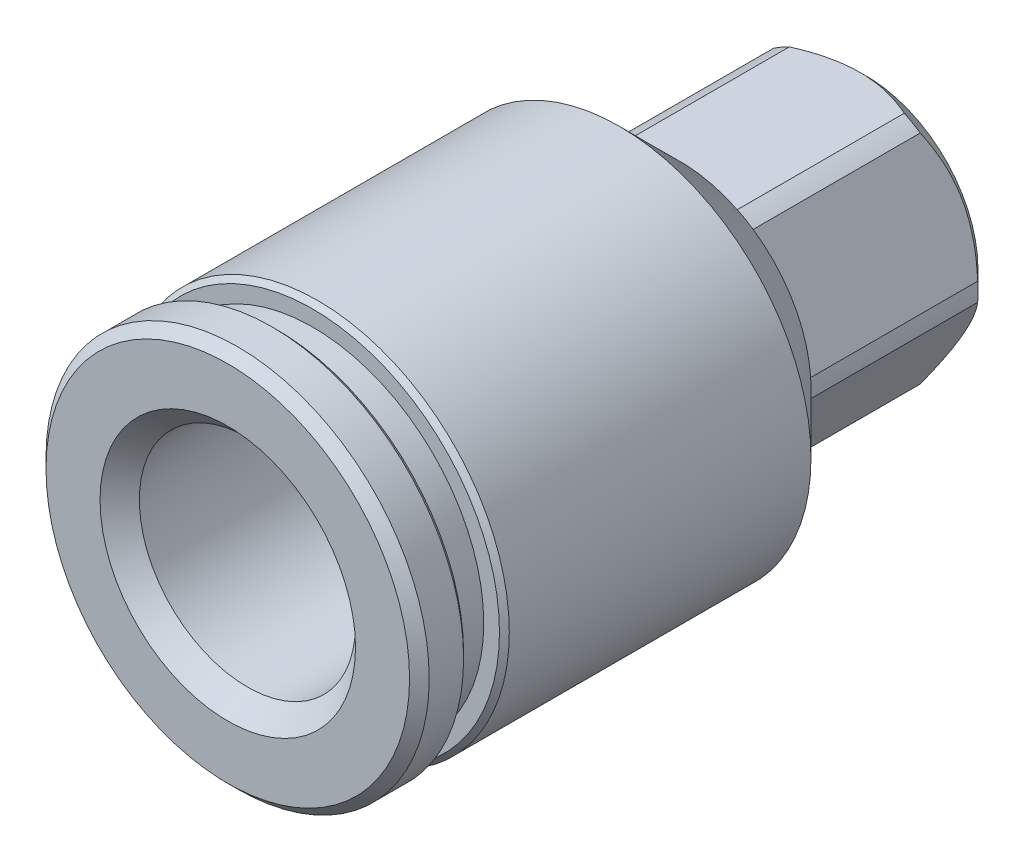
ISO-10303-21;
HEADER;
FILE_DESCRIPTION(('STEP AP214'),'2;1');
FILE_NAME('part.step','',(''),(''),'','','');
FILE_SCHEMA(('AUTOMOTIVE_DESIGN { 1 0 10303 214 1 1 1 1 }'));
ENDSEC;
DATA;
#1=APPLICATION_CONTEXT('core data for automotive mechanical design processes');
#2=APPLICATION_PROTOCOL_DEFINITION('international standard','automotive_design',2000,#1);
#3=PRODUCT_CONTEXT('',#1,'mechanical');
#4=PRODUCT('Part','Part','',(#3));
#5=PRODUCT_RELATED_PRODUCT_CATEGORY('part','',(#4));
#6=PRODUCT_DEFINITION_FORMATION('','',#4);
#7=PRODUCT_DEFINITION_CONTEXT('part definition',#1,'design');
#8=PRODUCT_DEFINITION('design','',#6,#7);
#9=PRODUCT_DEFINITION_SHAPE('','',#8);
#10=(LENGTH_UNIT() NAMED_UNIT(*) SI_UNIT(.MILLI.,.METRE.));
#11=(NAMED_UNIT(*) PLANE_ANGLE_UNIT() SI_UNIT($,.RADIAN.));
#12=(NAMED_UNIT(*) SI_UNIT($,.STERADIAN.) SOLID_ANGLE_UNIT());
#13=UNCERTAINTY_MEASURE_WITH_UNIT(LENGTH_MEASURE(1.E-05),#10,'distance_accuracy_value','');
#14=(GEOMETRIC_REPRESENTATION_CONTEXT(3) GLOBAL_UNCERTAINTY_ASSIGNED_CONTEXT((#13)) GLOBAL_UNIT_ASSIGNED_CONTEXT((#10,
#11,#12)) REPRESENTATION_CONTEXT('',''));
#15=CARTESIAN_POINT('',(0.,0.,0.));
#16=DIRECTION('',(0.,0.,1.));
#17=DIRECTION('',(1.,0.,0.));
#18=AXIS2_PLACEMENT_3D('',#15,#16,#17);
#19=CARTESIAN_POINT('',(0.,0.,-65.));
#20=DIRECTION('',(0.,0.,1.));
#21=DIRECTION('',(1.,0.,0.));
#22=AXIS2_PLACEMENT_3D('',#19,#20,#21);
#23=CONICAL_SURFACE('',#22,11.35,0.785398163397434);
#24=CARTESIAN_POINT('',(0.,0.,-65.));
#25=DIRECTION('',(0.,0.,1.));
#26=DIRECTION('',(1.,0.,0.));
#27=AXIS2_PLACEMENT_3D('',#24,#25,#26);
#28=CIRCLE('',#27,11.35);
#29=CARTESIAN_POINT('',(11.35,0.,-65.));
#30=VERTEX_POINT('',#29);
#31=EDGE_CURVE('E12',#30,#30,#28,.T.);
#32=ORIENTED_EDGE('',*,*,#31,.T.);
#33=EDGE_LOOP('',(#32));
#34=FACE_BOUND('',#33,.T.);
#35=CARTESIAN_POINT('',(13.3175330433493,0.933356137441655,-62.9997999999999));
#36=CARTESIAN_POINT('',(13.107581088092,1.29700359109579,-63.1838289213796));
#37=CARTESIAN_POINT('',(12.8943576599389,1.66631740202087,-63.3547115315857));
#38=CARTESIAN_POINT('',(12.46114372675,2.41666594485073,-63.6631506433928));
#39=CARTESIAN_POINT('',(12.2411315290394,2.79773824957038,-63.8005843311892));
#40=CARTESIAN_POINT('',(11.9082338706203,3.37433390767311,-63.9747459432874));
#41=CARTESIAN_POINT('',(11.7974122503937,3.56628258448257,-64.0272632826221));
#42=CARTESIAN_POINT('',(11.574606297149,3.95219381573119,-64.1211840504004));
#43=CARTESIAN_POINT('',(11.4626221355784,4.14615607321463,-64.1625890941249));
#44=CARTESIAN_POINT('',(11.2378628931056,4.53545050064811,-64.2334541693245));
#45=CARTESIAN_POINT('',(11.1250890820435,4.7307804711708,-64.2629302295379));
#46=CARTESIAN_POINT('',(10.8988982922271,5.12255441133695,-64.3094045670442));
#47=CARTESIAN_POINT('',(10.7854813292948,5.31899835357589,-64.3264031499617));
#48=CARTESIAN_POINT('',(10.5656465420787,5.69976337430528,-64.3468709014907));
#49=CARTESIAN_POINT('',(10.4592472313394,5.88405238639599,-64.3511391875582));
#50=CARTESIAN_POINT('',(10.2464919242042,6.25255538793413,-64.348342437929));
#51=CARTESIAN_POINT('',(10.1401359256667,6.43676938109086,-64.3412780548952));
#52=CARTESIAN_POINT('',(9.92771138430616,6.80469947950177,-64.3159477033839));
#53=CARTESIAN_POINT('',(9.82164298796551,6.98841533104113,-64.2976768248806));
#54=CARTESIAN_POINT('',(9.61010842017716,7.35480395000769,-64.2502859501648));
#55=CARTESIAN_POINT('',(9.50464233893754,7.53747656118989,-64.2211643699888));
#56=CARTESIAN_POINT('',(9.18962933819775,8.08309508351595,-64.1183036629273));
#57=CARTESIAN_POINT('',(8.98131536768569,8.44390546436923,-64.0290491810026));
#58=CARTESIAN_POINT('',(8.56939078005538,9.15737977903178,-63.8147136095524));
#59=CARTESIAN_POINT('',(8.36578168436937,9.51004107764311,-63.6896211014258));
#60=CARTESIAN_POINT('',(8.0465301727725,10.0630009161221,-63.4673972169287));
#61=CARTESIAN_POINT('',(7.92916804664934,10.2662780814517,-63.3799429654052));
#62=CARTESIAN_POINT('',(7.7546679780071,10.5685210662643,-63.2420961830428));
#63=CARTESIAN_POINT('',(7.69685211821126,10.668661072914,-63.1951188998973));
#64=CARTESIAN_POINT('',(7.58164348742745,10.868208274902,-63.0990262705877));
#65=CARTESIAN_POINT('',(7.52425086378998,10.9676152150217,-63.049910217426));
#66=CARTESIAN_POINT('',(7.46707664747725,11.0666438625583,-62.9997999999999));
#67=B_SPLINE_CURVE_WITH_KNOTS('',3,(#35,#36,#37,#38,#39,#40,#41,#42,#43,#44,#45,#46,#47,#48,#49,
#50,#51,#52,#53,#54,#55,#56,#57,#58,#59,#60,#61,#62,#63,#64,#65,#66),.UNSPECIFIED.,.F.,.F.,(4,2,
2,2,2,2,2,2,2,2,2,2,2,2,2,4),(0.,1.37630499030271,2.75758957563814,3.44067512595391,
4.12366132926286,4.80572674601863,5.48777545563401,6.12600110486054,6.76418999917248,
7.40265871018195,8.04122066010621,9.31743314078434,10.5940526974263,11.345327394544,
11.7197376011185,12.0942725274741),.UNSPECIFIED.);
#68=CARTESIAN_POINT('',(13.3173048454133,0.933751387861032,-62.9999999999999));
#69=VERTEX_POINT('',#68);
#70=CARTESIAN_POINT('',(7.46730484541327,11.066248612139,-62.9999999999999));
#71=VERTEX_POINT('',#70);
#72=EDGE_CURVE('E299',#69,#71,#67,.T.);
#73=ORIENTED_EDGE('',*,*,#72,.F.);
#74=CARTESIAN_POINT('',(0.,0.,-62.9999999999999));
#75=DIRECTION('',(0.,0.,1.));
#76=DIRECTION('',(1.,0.,0.));
#77=AXIS2_PLACEMENT_3D('',#74,#75,#76);
#78=CIRCLE('',#77,13.35);
#79=CARTESIAN_POINT('',(13.3173048454133,-0.933751387861046,-62.9999999999999));
#80=VERTEX_POINT('',#79);
#81=EDGE_CURVE('E170',#80,#69,#78,.T.);
#82=ORIENTED_EDGE('',*,*,#81,.F.);
#83=CARTESIAN_POINT('',(7.46707664747724,-11.0666438625583,-62.9997999999999));
#84=CARTESIAN_POINT('',(7.67702860273458,-10.7029964089042,-63.1838289213796));
#85=CARTESIAN_POINT('',(7.89025203088762,-10.3336825979791,-63.3547115315857));
#86=CARTESIAN_POINT('',(8.32346596407649,-9.58333405514926,-63.6631506433928));
#87=CARTESIAN_POINT('',(8.54347816178709,-9.20226175042961,-63.8005843311892));
#88=CARTESIAN_POINT('',(8.87637582020627,-8.62566609232688,-63.9747459432874));
#89=CARTESIAN_POINT('',(8.9871974404328,-8.43371741551741,-64.0272632826221));
#90=CARTESIAN_POINT('',(9.2100033936775,-8.0478061842688,-64.1211840504004));
#91=CARTESIAN_POINT('',(9.32198755524819,-7.85384392678536,-64.1625890941249));
#92=CARTESIAN_POINT('',(9.54674679772093,-7.46454949935187,-64.2334541693245));
#93=CARTESIAN_POINT('',(9.65952060878301,-7.26921952882918,-64.2629302295379));
#94=CARTESIAN_POINT('',(9.88571139859941,-6.87744558866303,-64.3094045670442));
#95=CARTESIAN_POINT('',(9.99912836153174,-6.68100164642409,-64.3264031499617));
#96=CARTESIAN_POINT('',(10.2189631487478,-6.3002366256947,-64.3468709014907));
#97=CARTESIAN_POINT('',(10.3253624594871,-6.11594761360399,-64.3511391875582));
#98=CARTESIAN_POINT('',(10.5381177666223,-5.74744461206585,-64.348342437929));
#99=CARTESIAN_POINT('',(10.6444737651599,-5.56323061890912,-64.3412780548952));
#100=CARTESIAN_POINT('',(10.8568983065204,-5.19530052049821,-64.3159477033839));
#101=CARTESIAN_POINT('',(10.962966702861,-5.01158466895885,-64.2976768248806));
#102=CARTESIAN_POINT('',(11.1745012706494,-4.6451960499923,-64.2502859501648));
#103=CARTESIAN_POINT('',(11.279967351889,-4.4625234388101,-64.2211643699888));
#104=CARTESIAN_POINT('',(11.5949803526288,-3.91690491648404,-64.1183036629273));
#105=CARTESIAN_POINT('',(11.8032943231408,-3.55609453563076,-64.0290491810026));
#106=CARTESIAN_POINT('',(12.2152189107711,-2.84262022096821,-63.8147136095524));
#107=CARTESIAN_POINT('',(12.4188280064572,-2.48995892235689,-63.6896211014257));
#108=CARTESIAN_POINT('',(12.738079518054,-1.93699908387794,-63.4673972169287));
#109=CARTESIAN_POINT('',(12.8554416441772,-1.73372191854831,-63.3799429654052));
#110=CARTESIAN_POINT('',(13.0299417128194,-1.4314789337357,-63.2420961830428));
#111=CARTESIAN_POINT('',(13.0877575726153,-1.33133892708603,-63.1951188998973));
#112=CARTESIAN_POINT('',(13.2029662033991,-1.13179172509804,-63.0990262705877));
#113=CARTESIAN_POINT('',(13.2603588270365,-1.03238478497826,-63.049910217426));
#114=CARTESIAN_POINT('',(13.3175330433493,-0.933356137441667,-62.9997999999999));
#115=B_SPLINE_CURVE_WITH_KNOTS('',3,(#83,#84,#85,#86,#87,#88,#89,#90,#91,#92,#93,#94,#95,#96,
#97,#98,#99,#100,#101,#102,#103,#104,#105,#106,#107,#108,#109,#110,#111,#112,#113,#114),
.UNSPECIFIED.,.F.,.F.,(4,2,2,2,2,2,2,2,2,2,2,2,2,2,2,4),(0.,1.37630499030272,2.75758957563815,
3.44067512595393,4.12366132926287,4.80572674601865,5.48777545563403,6.12600110486056,
6.7641899991725,7.40265871018196,8.04122066010622,9.31743314078435,10.5940526974263,
11.345327394544,11.7197376011185,12.0942725274741),.UNSPECIFIED.);
#116=CARTESIAN_POINT('',(7.46730484541327,-11.066248612139,-62.9999999999999));
#117=VERTEX_POINT('',#116);
#118=EDGE_CURVE('E156',#117,#80,#115,.T.);
#119=ORIENTED_EDGE('',*,*,#118,.F.);
#120=CARTESIAN_POINT('',(5.84999999999999,-12.,-62.9999999999999));
#121=VERTEX_POINT('',#120);
#122=EDGE_CURVE('E154',#121,#117,#78,.T.);
#123=ORIENTED_EDGE('',*,*,#122,.F.);
#124=CARTESIAN_POINT('',(-13.9959671430104,-12.,-57.9139728718947));
#125=CARTESIAN_POINT('',(-13.655972504965,-12.,-58.1720260418189));
#126=CARTESIAN_POINT('',(-13.3140943340846,-12.,-58.4276375764839));
#127=CARTESIAN_POINT('',(-12.6258202988367,-12.,-58.9328778380004));
#128=CARTESIAN_POINT('',(-12.2794233399434,-12.,-59.1825050721873));
#129=CARTESIAN_POINT('',(-11.5788269287501,-12.,-59.6764532175205));
#130=CARTESIAN_POINT('',(-11.2245878331731,-12.,-59.9207180889164));
#131=CARTESIAN_POINT('',(-10.510128396445,-12.,-60.4003089568614));
#132=CARTESIAN_POINT('',(-10.1499084771657,-12.,-60.6356355800741));
#133=CARTESIAN_POINT('',(-9.40110346500125,-12.,-61.1088836933085));
#134=CARTESIAN_POINT('',(-9.01209711891329,-12.,-61.3461420219312));
#135=CARTESIAN_POINT('',(-8.22498597801741,-12.,-61.8053041441749));
#136=CARTESIAN_POINT('',(-7.82687973011901,-12.,-62.0272054624484));
#137=CARTESIAN_POINT('',(-7.02156471949106,-12.,-62.4508828099975));
#138=CARTESIAN_POINT('',(-6.61438733055164,-12.,-62.6527180069125));
#139=CARTESIAN_POINT('',(-5.78881085576363,-12.,-63.0317434056531));
#140=CARTESIAN_POINT('',(-5.37041701747139,-12.,-63.2089449002385));
#141=CARTESIAN_POINT('',(-4.55809160543395,-12.,-63.5184901303749));
#142=CARTESIAN_POINT('',(-4.16513944668681,-12.,-63.653377621918));
#143=CARTESIAN_POINT('',(-3.36961858582673,-12.,-63.8916511296326));
#144=CARTESIAN_POINT('',(-2.96704923813904,-12.,-63.9950350246127));
#145=CARTESIAN_POINT('',(-2.16148026748497,-12.,-64.1631281310119));
#146=CARTESIAN_POINT('',(-1.75862355772667,-12.,-64.228510979135));
#147=CARTESIAN_POINT('',(-0.948406607495053,-12.,-64.3193046012214));
#148=CARTESIAN_POINT('',(-0.541047197216002,-12.,-64.3447226239451));
#149=CARTESIAN_POINT('',(0.258556700782232,-12.,-64.3536198703743));
#150=CARTESIAN_POINT('',(0.650784241377107,-12.,-64.3386638203498));
#151=CARTESIAN_POINT('',(1.43196598801515,-12.,-64.2711338455311));
#152=CARTESIAN_POINT('',(1.82091987787232,-12.,-64.2185563283062));
#153=CARTESIAN_POINT('',(2.59931862183159,-12.,-64.0777870116478));
#154=CARTESIAN_POINT('',(2.98865092141848,-12.,-63.9889828662625));
#155=CARTESIAN_POINT('',(3.75880927651416,-12.,-63.7805494475961));
#156=CARTESIAN_POINT('',(4.13963597901562,-12.,-63.6609225276393));
#157=CARTESIAN_POINT('',(4.92327190267341,-12.,-63.3849270733333));
#158=CARTESIAN_POINT('',(5.3252902568966,-12.,-63.2263364217151));
#159=CARTESIAN_POINT('',(6.11891723152593,-12.,-62.8847582802187));
#160=CARTESIAN_POINT('',(6.51052094914837,-12.,-62.701759535581));
#161=CARTESIAN_POINT('',(7.28521230914159,-12.,-62.3157142979146));
#162=CARTESIAN_POINT('',(7.66826850616428,-12.,-62.1126052113187));
#163=CARTESIAN_POINT('',(8.42557770417047,-12.,-61.6908225727586));
#164=CARTESIAN_POINT('',(8.79983207919242,-12.,-61.4721514719033));
#165=CARTESIAN_POINT('',(9.52231682630743,-12.,-61.0334629008683));
#166=CARTESIAN_POINT('',(9.87091685808529,-12.,-60.8140510166536));
#167=CARTESIAN_POINT('',(10.5621306733485,-12.,-60.3659643480273));
#168=CARTESIAN_POINT('',(10.9047440019258,-12.,-60.1372888640514));
#169=CARTESIAN_POINT('',(11.5819966281995,-12.,-59.6742100755807));
#170=CARTESIAN_POINT('',(11.9166780232737,-12.,-59.4398681176826));
#171=CARTESIAN_POINT('',(12.5814612541788,-12.,-58.964959807398));
#172=CARTESIAN_POINT('',(12.9115643251747,-12.,-58.7243951860269));
#173=CARTESIAN_POINT('',(13.2397491555612,-12.,-58.4812855050457));
#174=B_SPLINE_CURVE_WITH_KNOTS('',3,(#124,#125,#126,#127,#128,#129,#130,#131,#132,#133,#134,
#135,#136,#137,#138,#139,#140,#141,#142,#143,#144,#145,#146,#147,#148,#149,#150,#151,#152,#153,
#154,#155,#156,#157,#158,#159,#160,#161,#162,#163,#164,#165,#166,#167,#168,#169,#170,#171,#172,
#173),.UNSPECIFIED.,.F.,.F.,(4,2,2,2,2,2,2,2,2,2,2,2,2,2,2,2,2,2,2,2,2,2,2,2,4),(0.,
1.2805286669691,2.56137348123737,3.85213402337947,5.14280390219152,6.50947376830465,
7.8763634129536,9.23909498419655,10.6011997674229,11.8464874157793,13.0918588929809,
14.3144217882291,15.5367629112497,16.7124180863993,17.8881855384946,19.0847099166776,
20.2811429670701,21.5766445337847,22.8727455448425,24.1730156891325,25.473081484558,
26.7086166231792,27.9442452409692,29.169872099187,30.3951616042759),.UNSPECIFIED.);
#175=CARTESIAN_POINT('',(-5.84999999999999,-12.,-62.9999999999999));
#176=VERTEX_POINT('',#175);
#177=EDGE_CURVE('E222',#176,#121,#174,.T.);
#178=ORIENTED_EDGE('',*,*,#177,.F.);
#179=CARTESIAN_POINT('',(-7.46730484541327,-11.066248612139,-62.9999999999999));
#180=VERTEX_POINT('',#179);
#181=EDGE_CURVE('E181',#180,#176,#78,.T.);
#182=ORIENTED_EDGE('',*,*,#181,.F.);
#183=CARTESIAN_POINT('',(-13.3175330433493,-0.933356137441659,-62.9997999999999));
#184=CARTESIAN_POINT('',(-13.1075810880919,-1.29700359109579,-63.1838289213796));
#185=CARTESIAN_POINT('',(-12.8943576599389,-1.66631740202087,-63.3547115315857));
#186=CARTESIAN_POINT('',(-12.46114372675,-2.41666594485073,-63.6631506433928));
#187=CARTESIAN_POINT('',(-12.2411315290394,-2.79773824957038,-63.8005843311892));
#188=CARTESIAN_POINT('',(-11.9082338706203,-3.37433390767311,-63.9747459432874));
#189=CARTESIAN_POINT('',(-11.7974122503937,-3.56628258448258,-64.0272632826221));
#190=CARTESIAN_POINT('',(-11.574606297149,-3.9521938157312,-64.1211840504004));
#191=CARTESIAN_POINT('',(-11.4626221355783,-4.14615607321463,-64.1625890941249));
#192=CARTESIAN_POINT('',(-11.2378628931056,-4.53545050064812,-64.2334541693245));
#193=CARTESIAN_POINT('',(-11.1250890820435,-4.7307804711708,-64.2629302295379));
#194=CARTESIAN_POINT('',(-10.8988982922271,-5.12255441133695,-64.3094045670442));
#195=CARTESIAN_POINT('',(-10.7854813292948,-5.3189983535759,-64.3264031499617));
#196=CARTESIAN_POINT('',(-10.5656465420787,-5.69976337430529,-64.3468709014907));
#197=CARTESIAN_POINT('',(-10.4592472313394,-5.88405238639599,-64.3511391875582));
#198=CARTESIAN_POINT('',(-10.2464919242042,-6.25255538793414,-64.348342437929));
#199=CARTESIAN_POINT('',(-10.1401359256667,-6.43676938109087,-64.3412780548952));
#200=CARTESIAN_POINT('',(-9.92771138430616,-6.80469947950178,-64.3159477033839));
#201=CARTESIAN_POINT('',(-9.82164298796551,-6.98841533104114,-64.2976768248806));
#202=CARTESIAN_POINT('',(-9.61010842017716,-7.35480395000769,-64.2502859501648));
#203=CARTESIAN_POINT('',(-9.50464233893754,-7.53747656118989,-64.2211643699888));
#204=CARTESIAN_POINT('',(-9.18962933819774,-8.08309508351596,-64.1183036629273));
#205=CARTESIAN_POINT('',(-8.98131536768569,-8.44390546436924,-64.0290491810026));
#206=CARTESIAN_POINT('',(-8.56939078005538,-9.15737977903179,-63.8147136095524));
#207=CARTESIAN_POINT('',(-8.36578168436937,-9.51004107764311,-63.6896211014258));
#208=CARTESIAN_POINT('',(-8.0465301727725,-10.0630009161221,-63.4673972169287));
#209=CARTESIAN_POINT('',(-7.92916804664934,-10.2662780814517,-63.3799429654052));
#210=CARTESIAN_POINT('',(-7.7546679780071,-10.5685210662643,-63.2420961830428));
#211=CARTESIAN_POINT('',(-7.69685211821126,-10.668661072914,-63.1951188998973));
#212=CARTESIAN_POINT('',(-7.58164348742745,-10.868208274902,-63.0990262705877));
#213=CARTESIAN_POINT('',(-7.52425086378998,-10.9676152150217,-63.049910217426));
#214=CARTESIAN_POINT('',(-7.46707664747724,-11.0666438625583,-62.9997999999999));
#215=B_SPLINE_CURVE_WITH_KNOTS('',3,(#183,#184,#185,#186,#187,#188,#189,#190,#191,#192,#193,
#194,#195,#196,#197,#198,#199,#200,#201,#202,#203,#204,#205,#206,#207,#208,#209,#210,#211,#212,
#213,#214),.UNSPECIFIED.,.F.,.F.,(4,2,2,2,2,2,2,2,2,2,2,2,2,2,2,4),(0.,1.37630499030271,
2.75758957563814,3.44067512595391,4.12366132926286,4.80572674601863,5.48777545563401,
6.12600110486055,6.76418999917248,7.40265871018195,8.04122066010621,9.31743314078434,
10.5940526974263,11.345327394544,11.7197376011185,12.0942725274741),.UNSPECIFIED.);
#216=CARTESIAN_POINT('',(-13.3173048454133,-0.933751387861039,-62.9999999999999));
#217=VERTEX_POINT('',#216);
#218=EDGE_CURVE('E221',#217,#180,#215,.T.);
#219=ORIENTED_EDGE('',*,*,#218,.F.);
#220=CARTESIAN_POINT('',(-13.3173048454133,0.93375138786104,-62.9999999999999));
#221=VERTEX_POINT('',#220);
#222=EDGE_CURVE('E192',#221,#217,#78,.T.);
#223=ORIENTED_EDGE('',*,*,#222,.F.);
#224=CARTESIAN_POINT('',(-7.46707664747724,11.0666438625583,-62.9997999999999));
#225=CARTESIAN_POINT('',(-7.67702860273458,10.7029964089042,-63.1838289213796));
#226=CARTESIAN_POINT('',(-7.89025203088762,10.3336825979791,-63.3547115315857));
#227=CARTESIAN_POINT('',(-8.32346596407648,9.58333405514926,-63.6631506433928));
#228=CARTESIAN_POINT('',(-8.54347816178708,9.20226175042962,-63.8005843311892));
#229=CARTESIAN_POINT('',(-8.87637582020627,8.62566609232689,-63.9747459432874));
#230=CARTESIAN_POINT('',(-8.9871974404328,8.43371741551742,-64.0272632826221));
#231=CARTESIAN_POINT('',(-9.21000339367749,8.0478061842688,-64.1211840504004));
#232=CARTESIAN_POINT('',(-9.32198755524818,7.85384392678537,-64.1625890941249));
#233=CARTESIAN_POINT('',(-9.54674679772092,7.46454949935188,-64.2334541693245));
#234=CARTESIAN_POINT('',(-9.659520608783,7.2692195288292,-64.2629302295379));
#235=CARTESIAN_POINT('',(-9.8857113985994,6.87744558866305,-64.3094045670442));
#236=CARTESIAN_POINT('',(-9.99912836153173,6.68100164642411,-64.3264031499617));
#237=CARTESIAN_POINT('',(-10.2189631487478,6.30023662569472,-64.3468709014907));
#238=CARTESIAN_POINT('',(-10.3253624594871,6.11594761360401,-64.3511391875582));
#239=CARTESIAN_POINT('',(-10.5381177666223,5.74744461206587,-64.348342437929));
#240=CARTESIAN_POINT('',(-10.6444737651599,5.56323061890913,-64.3412780548952));
#241=CARTESIAN_POINT('',(-10.8568983065204,5.19530052049822,-64.3159477033839));
#242=CARTESIAN_POINT('',(-10.962966702861,5.01158466895886,-64.2976768248806));
#243=CARTESIAN_POINT('',(-11.1745012706494,4.64519604999231,-64.2502859501648));
#244=CARTESIAN_POINT('',(-11.279967351889,4.46252343881011,-64.2211643699888));
#245=CARTESIAN_POINT('',(-11.5949803526288,3.91690491648405,-64.1183036629273));
#246=CARTESIAN_POINT('',(-11.8032943231408,3.55609453563076,-64.0290491810026));
#247=CARTESIAN_POINT('',(-12.2152189107711,2.84262022096822,-63.8147136095524));
#248=CARTESIAN_POINT('',(-12.4188280064572,2.48995892235689,-63.6896211014258));
#249=CARTESIAN_POINT('',(-12.738079518054,1.93699908387794,-63.4673972169287));
#250=CARTESIAN_POINT('',(-12.8554416441772,1.73372191854832,-63.3799429654052));
#251=CARTESIAN_POINT('',(-13.0299417128194,1.43147893373571,-63.2420961830428));
#252=CARTESIAN_POINT('',(-13.0877575726153,1.33133892708603,-63.1951188998973));
#253=CARTESIAN_POINT('',(-13.2029662033991,1.13179172509804,-63.0990262705877));
#254=CARTESIAN_POINT('',(-13.2603588270365,1.03238478497826,-63.049910217426));
#255=CARTESIAN_POINT('',(-13.3175330433493,0.933356137441664,-62.9997999999999));
#256=B_SPLINE_CURVE_WITH_KNOTS('',3,(#224,#225,#226,#227,#228,#229,#230,#231,#232,#233,#234,
#235,#236,#237,#238,#239,#240,#241,#242,#243,#244,#245,#246,#247,#248,#249,#250,#251,#252,#253,
#254,#255),.UNSPECIFIED.,.F.,.F.,(4,2,2,2,2,2,2,2,2,2,2,2,2,2,2,4),(0.,1.37630499030271,
2.75758957563814,3.44067512595391,4.12366132926286,4.80572674601863,5.48777545563401,
6.12600110486054,6.76418999917248,7.40265871018195,8.04122066010621,9.31743314078434,
10.5940526974263,11.345327394544,11.7197376011185,12.0942725274741),.UNSPECIFIED.);
#257=CARTESIAN_POINT('',(-7.46730484541327,11.066248612139,-62.9999999999999));
#258=VERTEX_POINT('',#257);
#259=EDGE_CURVE('E401',#258,#221,#256,.T.);
#260=ORIENTED_EDGE('',*,*,#259,.F.);
#261=CARTESIAN_POINT('',(-5.84999999999999,12.,-62.9999999999999));
#262=VERTEX_POINT('',#261);
#263=EDGE_CURVE('E184',#262,#258,#78,.T.);
#264=ORIENTED_EDGE('',*,*,#263,.F.);
#265=CARTESIAN_POINT('',(-13.9959671430104,12.,-57.9139728718947));
#266=CARTESIAN_POINT('',(-13.655972504965,12.,-58.1720260418189));
#267=CARTESIAN_POINT('',(-13.3140943340846,12.,-58.4276375764839));
#268=CARTESIAN_POINT('',(-12.6258202988367,12.,-58.9328778380004));
#269=CARTESIAN_POINT('',(-12.2794233399434,12.,-59.1825050721874));
#270=CARTESIAN_POINT('',(-11.5788269287501,12.,-59.6764532175205));
#271=CARTESIAN_POINT('',(-11.2245878331731,12.,-59.9207180889164));
#272=CARTESIAN_POINT('',(-10.510128396445,12.,-60.4003089568614));
#273=CARTESIAN_POINT('',(-10.1499084771657,12.,-60.6356355800741));
#274=CARTESIAN_POINT('',(-9.40110346500124,12.,-61.1088836933085));
#275=CARTESIAN_POINT('',(-9.01209711891329,12.,-61.3461420219312));
#276=CARTESIAN_POINT('',(-8.22498597801741,12.,-61.8053041441749));
#277=CARTESIAN_POINT('',(-7.82687973011901,12.,-62.0272054624484));
#278=CARTESIAN_POINT('',(-7.02156471949106,12.,-62.4508828099975));
#279=CARTESIAN_POINT('',(-6.61438733055164,12.,-62.6527180069125));
#280=CARTESIAN_POINT('',(-5.78881085576362,12.,-63.0317434056531));
#281=CARTESIAN_POINT('',(-5.37041701747138,12.,-63.2089449002385));
#282=CARTESIAN_POINT('',(-4.55809160543393,12.,-63.5184901303749));
#283=CARTESIAN_POINT('',(-4.1651394466868,12.,-63.653377621918));
#284=CARTESIAN_POINT('',(-3.36961858582673,12.,-63.8916511296326));
#285=CARTESIAN_POINT('',(-2.96704923813903,12.,-63.9950350246127));
#286=CARTESIAN_POINT('',(-2.16148026748496,12.,-64.1631281310119));
#287=CARTESIAN_POINT('',(-1.75862355772666,12.,-64.228510979135));
#288=CARTESIAN_POINT('',(-0.948406607495045,12.,-64.3193046012214));
#289=CARTESIAN_POINT('',(-0.541047197215995,12.,-64.3447226239451));
#290=CARTESIAN_POINT('',(0.258556700782238,12.,-64.3536198703743));
#291=CARTESIAN_POINT('',(0.650784241377112,12.,-64.3386638203498));
#292=CARTESIAN_POINT('',(1.43196598801516,12.,-64.2711338455311));
#293=CARTESIAN_POINT('',(1.82091987787232,12.,-64.2185563283062));
#294=CARTESIAN_POINT('',(2.59931862183159,12.,-64.0777870116478));
#295=CARTESIAN_POINT('',(2.98865092141848,12.,-63.9889828662625));
#296=CARTESIAN_POINT('',(3.75880927651416,12.,-63.7805494475961));
#297=CARTESIAN_POINT('',(4.13963597901563,12.,-63.6609225276393));
#298=CARTESIAN_POINT('',(4.92327190267341,12.,-63.3849270733333));
#299=CARTESIAN_POINT('',(5.3252902568966,12.,-63.2263364217151));
#300=CARTESIAN_POINT('',(6.11891723152594,12.,-62.8847582802187));
#301=CARTESIAN_POINT('',(6.51052094914838,12.,-62.701759535581));
#302=CARTESIAN_POINT('',(7.2852123091416,12.,-62.3157142979146));
#303=CARTESIAN_POINT('',(7.66826850616429,12.,-62.1126052113187));
#304=CARTESIAN_POINT('',(8.42557770417048,12.,-61.6908225727586));
#305=CARTESIAN_POINT('',(8.79983207919243,12.,-61.4721514719033));
#306=CARTESIAN_POINT('',(9.52231682630744,12.,-61.0334629008683));
#307=CARTESIAN_POINT('',(9.8709168580853,12.,-60.8140510166536));
#308=CARTESIAN_POINT('',(10.5621306733485,12.,-60.3659643480273));
#309=CARTESIAN_POINT('',(10.9047440019258,12.,-60.1372888640514));
#310=CARTESIAN_POINT('',(11.5819966281995,12.,-59.6742100755807));
#311=CARTESIAN_POINT('',(11.9166780232737,12.,-59.4398681176826));
#312=CARTESIAN_POINT('',(12.5814612541788,12.,-58.964959807398));
#313=CARTESIAN_POINT('',(12.9115643251748,12.,-58.7243951860269));
#314=CARTESIAN_POINT('',(13.2397491555613,12.,-58.4812855050457));
#315=B_SPLINE_CURVE_WITH_KNOTS('',3,(#265,#266,#267,#268,#269,#270,#271,#272,#273,#274,#275,
#276,#277,#278,#279,#280,#281,#282,#283,#284,#285,#286,#287,#288,#289,#290,#291,#292,#293,#294,
#295,#296,#297,#298,#299,#300,#301,#302,#303,#304,#305,#306,#307,#308,#309,#310,#311,#312,#313,
#314),.UNSPECIFIED.,.F.,.F.,(4,2,2,2,2,2,2,2,2,2,2,2,2,2,2,2,2,2,2,2,2,2,2,2,4),(0.,
1.2805286669691,2.56137348123737,3.85213402337948,5.14280390219153,6.50947376830465,
7.8763634129536,9.23909498419655,10.6011997674229,11.8464874157793,13.0918588929809,
14.3144217882291,15.5367629112497,16.7124180863993,17.8881855384946,19.0847099166776,
20.2811429670701,21.5766445337847,22.8727455448425,24.1730156891325,25.473081484558,
26.7086166231792,27.9442452409692,29.169872099187,30.3951616042759),.UNSPECIFIED.);
#316=CARTESIAN_POINT('',(5.85,12.,-62.9999999999999));
#317=VERTEX_POINT('',#316);
#318=EDGE_CURVE('E380',#317,#262,#315,.F.);
#319=ORIENTED_EDGE('',*,*,#318,.F.);
#320=EDGE_CURVE('E48',#71,#317,#78,.T.);
#321=ORIENTED_EDGE('',*,*,#320,.F.);
#322=EDGE_LOOP('',(#73,#82,#119,#123,#178,#182,#219,#223,#260,#264,#319,#321));
#323=FACE_BOUND('',#322,.T.);
#324=ADVANCED_FACE('F39',(#34,#323),#23,.T.);
#325=CARTESIAN_POINT('',(0.,0.,0.));
#326=DIRECTION('',(0.,0.,1.));
#327=DIRECTION('',(1.,0.,0.));
#328=AXIS2_PLACEMENT_3D('',#325,#326,#327);
#329=CYLINDRICAL_SURFACE('',#328,13.35);
#330=DIRECTION('',(0.,0.,1.));
#331=VECTOR('',#330,1.);
#332=CARTESIAN_POINT('',(7.46730484541327,11.066248612139,0.));
#333=LINE('',#332,#331);
#334=CARTESIAN_POINT('',(7.46730484541327,11.066248612139,-46.));
#335=VERTEX_POINT('',#334);
#336=EDGE_CURVE('E294',#71,#335,#333,.T.);
#337=ORIENTED_EDGE('',*,*,#336,.F.);
#338=ORIENTED_EDGE('',*,*,#320,.T.);
#339=DIRECTION('',(0.,0.,1.));
#340=VECTOR('',#339,1.);
#341=CARTESIAN_POINT('',(5.85,12.,0.));
#342=LINE('',#341,#340);
#343=CARTESIAN_POINT('',(5.84999999999998,12.,-46.));
#344=VERTEX_POINT('',#343);
#345=EDGE_CURVE('E388',#344,#317,#342,.F.);
#346=ORIENTED_EDGE('',*,*,#345,.F.);
#347=CARTESIAN_POINT('',(0.,0.,-46.));
#348=DIRECTION('',(0.,0.,1.));
#349=DIRECTION('',(1.,0.,0.));
#350=AXIS2_PLACEMENT_3D('',#347,#348,#349);
#351=CIRCLE('',#350,13.35);
#352=EDGE_CURVE('E171',#335,#344,#351,.T.);
#353=ORIENTED_EDGE('',*,*,#352,.F.);
#354=EDGE_LOOP('',(#337,#338,#346,#353));
#355=FACE_BOUND('',#354,.T.);
#356=ADVANCED_FACE('F441',(#355),#329,.T.);
#357=DIRECTION('',(0.,0.,1.));
#358=VECTOR('',#357,1.);
#359=CARTESIAN_POINT('',(13.3173048454133,0.933751387861032,0.));
#360=LINE('',#359,#358);
#361=CARTESIAN_POINT('',(13.3173048454133,0.933751387861051,-46.));
#362=VERTEX_POINT('',#361);
#363=EDGE_CURVE('E293',#362,#69,#360,.F.);
#364=ORIENTED_EDGE('',*,*,#363,.F.);
#365=CARTESIAN_POINT('',(13.3173048454133,-0.933751387861048,-46.));
#366=VERTEX_POINT('',#365);
#367=EDGE_CURVE('E134',#366,#362,#351,.T.);
#368=ORIENTED_EDGE('',*,*,#367,.F.);
#369=DIRECTION('',(0.,0.,1.));
#370=VECTOR('',#369,1.);
#371=CARTESIAN_POINT('',(13.3173048454133,-0.933751387861045,0.));
#372=LINE('',#371,#370);
#373=EDGE_CURVE('E142',#80,#366,#372,.T.);
#374=ORIENTED_EDGE('',*,*,#373,.F.);
#375=ORIENTED_EDGE('',*,*,#81,.T.);
#376=EDGE_LOOP('',(#364,#368,#374,#375));
#377=FACE_BOUND('',#376,.T.);
#378=ADVANCED_FACE('F297',(#377),#329,.T.);
#379=DIRECTION('',(0.,0.,1.));
#380=VECTOR('',#379,1.);
#381=CARTESIAN_POINT('',(-5.84999999999999,12.,0.));
#382=LINE('',#381,#380);
#383=CARTESIAN_POINT('',(-5.84999999999999,12.,-46.));
#384=VERTEX_POINT('',#383);
#385=EDGE_CURVE('E300',#262,#384,#382,.T.);
#386=ORIENTED_EDGE('',*,*,#385,.F.);
#387=ORIENTED_EDGE('',*,*,#263,.T.);
#388=DIRECTION('',(0.,0.,1.));
#389=VECTOR('',#388,1.);
#390=CARTESIAN_POINT('',(-7.46730484541327,11.066248612139,0.));
#391=LINE('',#390,#389);
#392=CARTESIAN_POINT('',(-7.46730484541328,11.0662486121389,-46.));
#393=VERTEX_POINT('',#392);
#394=EDGE_CURVE('E409',#393,#258,#391,.F.);
#395=ORIENTED_EDGE('',*,*,#394,.F.);
#396=EDGE_CURVE('E430',#384,#393,#351,.T.);
#397=ORIENTED_EDGE('',*,*,#396,.F.);
#398=EDGE_LOOP('',(#386,#387,#395,#397));
#399=FACE_BOUND('',#398,.T.);
#400=ADVANCED_FACE('F447',(#399),#329,.T.);
#401=DIRECTION('',(0.,0.,1.));
#402=VECTOR('',#401,1.);
#403=CARTESIAN_POINT('',(-13.3173048454133,0.933751387861044,0.));
#404=LINE('',#403,#402);
#405=CARTESIAN_POINT('',(-13.3173048454133,0.933751387861041,-46.));
#406=VERTEX_POINT('',#405);
#407=EDGE_CURVE('E408',#221,#406,#404,.T.);
#408=ORIENTED_EDGE('',*,*,#407,.F.);
#409=ORIENTED_EDGE('',*,*,#222,.T.);
#410=DIRECTION('',(0.,0.,1.));
#411=VECTOR('',#410,1.);
#412=CARTESIAN_POINT('',(-13.3173048454133,-0.933751387861039,0.));
#413=LINE('',#412,#411);
#414=CARTESIAN_POINT('',(-13.3173048454133,-0.933751387861046,-46.));
#415=VERTEX_POINT('',#414);
#416=EDGE_CURVE('E230',#415,#217,#413,.F.);
#417=ORIENTED_EDGE('',*,*,#416,.F.);
#418=EDGE_CURVE('E421',#406,#415,#351,.T.);
#419=ORIENTED_EDGE('',*,*,#418,.F.);
#420=EDGE_LOOP('',(#408,#409,#417,#419));
#421=FACE_BOUND('',#420,.T.);
#422=ADVANCED_FACE('F419',(#421),#329,.T.);
#423=DIRECTION('',(0.,0.,1.));
#424=VECTOR('',#423,1.);
#425=CARTESIAN_POINT('',(-7.46730484541327,-11.066248612139,0.));
#426=LINE('',#425,#424);
#427=CARTESIAN_POINT('',(-7.46730484541327,-11.066248612139,-46.));
#428=VERTEX_POINT('',#427);
#429=EDGE_CURVE('E216',#180,#428,#426,.T.);
#430=ORIENTED_EDGE('',*,*,#429,.F.);
#431=ORIENTED_EDGE('',*,*,#181,.T.);
#432=DIRECTION('',(0.,0.,1.));
#433=VECTOR('',#432,1.);
#434=CARTESIAN_POINT('',(-5.84999999999999,-12.,0.));
#435=LINE('',#434,#433);
#436=CARTESIAN_POINT('',(-5.84999999999998,-12.,-46.));
#437=VERTEX_POINT('',#436);
#438=EDGE_CURVE('E214',#437,#176,#435,.F.);
#439=ORIENTED_EDGE('',*,*,#438,.F.);
#440=EDGE_CURVE('E166',#428,#437,#351,.T.);
#441=ORIENTED_EDGE('',*,*,#440,.F.);
#442=EDGE_LOOP('',(#430,#431,#439,#441));
#443=FACE_BOUND('',#442,.T.);
#444=ADVANCED_FACE('F212',(#443),#329,.T.);
#445=DIRECTION('',(0.,0.,1.));
#446=VECTOR('',#445,1.);
#447=CARTESIAN_POINT('',(5.84999999999999,-12.,0.));
#448=LINE('',#447,#446);
#449=CARTESIAN_POINT('',(5.84999999999999,-12.,-46.));
#450=VERTEX_POINT('',#449);
#451=EDGE_CURVE('E225',#121,#450,#448,.T.);
#452=ORIENTED_EDGE('',*,*,#451,.F.);
#453=ORIENTED_EDGE('',*,*,#122,.T.);
#454=DIRECTION('',(0.,0.,1.));
#455=VECTOR('',#454,1.);
#456=CARTESIAN_POINT('',(7.46730484541327,-11.066248612139,0.));
#457=LINE('',#456,#455);
#458=CARTESIAN_POINT('',(7.46730484541327,-11.066248612139,-46.));
#459=VERTEX_POINT('',#458);
#460=EDGE_CURVE('E139',#459,#117,#457,.F.);
#461=ORIENTED_EDGE('',*,*,#460,.F.);
#462=EDGE_CURVE('E133',#450,#459,#351,.T.);
#463=ORIENTED_EDGE('',*,*,#462,.F.);
#464=EDGE_LOOP('',(#452,#453,#461,#463));
#465=FACE_BOUND('',#464,.T.);
#466=ADVANCED_FACE('F151',(#465),#329,.T.);
#467=CARTESIAN_POINT('',(0.,11.35,-65.));
#468=DIRECTION('',(0.,0.,1.));
#469=DIRECTION('',(1.,0.,0.));
#470=AXIS2_PLACEMENT_3D('',#467,#468,#469);
#471=PLANE('',#470);
#472=ORIENTED_EDGE('',*,*,#31,.F.);
#473=EDGE_LOOP('',(#472));
#474=FACE_BOUND('',#473,.T.);
#475=ADVANCED_FACE('F41',(#474),#471,.F.);
#476=CARTESIAN_POINT('',(0.,0.,-46.));
#477=DIRECTION('',(0.,0.,1.));
#478=DIRECTION('',(1.,0.,0.));
#479=AXIS2_PLACEMENT_3D('',#476,#477,#478);
#480=CONICAL_SURFACE('',#479,13.35,0.785398163397434);
#481=CARTESIAN_POINT('',(0.,0.,-39.8499999999998));
#482=DIRECTION('',(0.,0.,1.));
#483=DIRECTION('',(1.,0.,0.));
#484=AXIS2_PLACEMENT_3D('',#481,#482,#483);
#485=CIRCLE('',#484,19.5);
#486=CARTESIAN_POINT('',(19.5,0.,-39.8499999999998));
#487=VERTEX_POINT('',#486);
#488=EDGE_CURVE('E172',#487,#487,#485,.T.);
#489=ORIENTED_EDGE('',*,*,#488,.F.);
#490=EDGE_LOOP('',(#489));
#491=FACE_BOUND('',#490,.T.);
#492=EDGE_CURVE('E167',#362,#335,#351,.T.);
#493=ORIENTED_EDGE('',*,*,#492,.T.);
#494=ORIENTED_EDGE('',*,*,#352,.T.);
#495=EDGE_CURVE('E435',#344,#384,#351,.T.);
#496=ORIENTED_EDGE('',*,*,#495,.T.);
#497=ORIENTED_EDGE('',*,*,#396,.T.);
#498=EDGE_CURVE('E425',#393,#406,#351,.T.);
#499=ORIENTED_EDGE('',*,*,#498,.T.);
#500=ORIENTED_EDGE('',*,*,#418,.T.);
#501=EDGE_CURVE('E426',#415,#428,#351,.T.);
#502=ORIENTED_EDGE('',*,*,#501,.T.);
#503=ORIENTED_EDGE('',*,*,#440,.T.);
#504=EDGE_CURVE('E162',#437,#450,#351,.T.);
#505=ORIENTED_EDGE('',*,*,#504,.T.);
#506=ORIENTED_EDGE('',*,*,#462,.T.);
#507=EDGE_CURVE('E127',#459,#366,#351,.T.);
#508=ORIENTED_EDGE('',*,*,#507,.T.);
#509=ORIENTED_EDGE('',*,*,#367,.T.);
#510=EDGE_LOOP('',(#493,#494,#496,#497,#499,#500,#502,#503,#505,#506,#508,#509));
#511=FACE_BOUND('',#510,.T.);
#512=ADVANCED_FACE('F160',(#491,#511),#480,.T.);
#513=CARTESIAN_POINT('',(0.,0.,0.));
#514=DIRECTION('',(0.,0.,1.));
#515=DIRECTION('',(1.,0.,0.));
#516=AXIS2_PLACEMENT_3D('',#513,#514,#515);
#517=CYLINDRICAL_SURFACE('',#516,19.5);
#518=CARTESIAN_POINT('',(0.,0.,-9.15));
#519=DIRECTION('',(0.,0.,1.));
#520=DIRECTION('',(1.,0.,0.));
#521=AXIS2_PLACEMENT_3D('',#518,#519,#520);
#522=CIRCLE('',#521,19.5);
#523=CARTESIAN_POINT('',(19.5,0.,-9.15));
#524=VERTEX_POINT('',#523);
#525=EDGE_CURVE('E307',#524,#524,#522,.T.);
#526=ORIENTED_EDGE('',*,*,#525,.F.);
#527=EDGE_LOOP('',(#526));
#528=FACE_BOUND('',#527,.T.);
#529=ORIENTED_EDGE('',*,*,#488,.T.);
#530=EDGE_LOOP('',(#529));
#531=FACE_BOUND('',#530,.T.);
#532=ADVANCED_FACE('F600',(#528,#531),#517,.T.);
#533=CARTESIAN_POINT('',(0.,0.,-9.15));
#534=DIRECTION('',(0.,0.,-1.));
#535=DIRECTION('',(-1.,0.,0.));
#536=AXIS2_PLACEMENT_3D('',#533,#534,#535);
#537=CONICAL_SURFACE('',#536,19.5,0.785398163397448);
#538=CARTESIAN_POINT('',(0.,0.,-8.65));
#539=DIRECTION('',(0.,0.,1.));
#540=DIRECTION('',(1.,0.,0.));
#541=AXIS2_PLACEMENT_3D('',#538,#539,#540);
#542=CIRCLE('',#541,19.);
#543=CARTESIAN_POINT('',(19.,0.,-8.65));
#544=VERTEX_POINT('',#543);
#545=EDGE_CURVE('E313',#544,#544,#542,.T.);
#546=ORIENTED_EDGE('',*,*,#545,.F.);
#547=EDGE_LOOP('',(#546));
#548=FACE_BOUND('',#547,.T.);
#549=ORIENTED_EDGE('',*,*,#525,.T.);
#550=EDGE_LOOP('',(#549));
#551=FACE_BOUND('',#550,.T.);
#552=ADVANCED_FACE('F784',(#548,#551),#537,.T.);
#553=CARTESIAN_POINT('',(0.,17.4,-8.65));
#554=DIRECTION('',(0.,0.,-1.));
#555=DIRECTION('',(-1.,0.,0.));
#556=AXIS2_PLACEMENT_3D('',#553,#554,#555);
#557=PLANE('',#556);
#558=CARTESIAN_POINT('',(0.,0.,-8.65));
#559=DIRECTION('',(0.,0.,1.));
#560=DIRECTION('',(1.,0.,0.));
#561=AXIS2_PLACEMENT_3D('',#558,#559,#560);
#562=CIRCLE('',#561,17.4);
#563=CARTESIAN_POINT('',(17.4,0.,-8.65));
#564=VERTEX_POINT('',#563);
#565=EDGE_CURVE('E319',#564,#564,#562,.T.);
#566=ORIENTED_EDGE('',*,*,#565,.F.);
#567=EDGE_LOOP('',(#566));
#568=FACE_BOUND('',#567,.T.);
#569=ORIENTED_EDGE('',*,*,#545,.T.);
#570=EDGE_LOOP('',(#569));
#571=FACE_BOUND('',#570,.T.);
#572=ADVANCED_FACE('F773',(#568,#571),#557,.F.);
#573=CARTESIAN_POINT('',(0.,0.,0.));
#574=DIRECTION('',(0.,0.,1.));
#575=DIRECTION('',(1.,0.,0.));
#576=AXIS2_PLACEMENT_3D('',#573,#574,#575);
#577=CYLINDRICAL_SURFACE('',#576,17.4);
#578=CARTESIAN_POINT('',(0.,0.,-5.));
#579=DIRECTION('',(0.,0.,1.));
#580=DIRECTION('',(1.,0.,0.));
#581=AXIS2_PLACEMENT_3D('',#578,#579,#580);
#582=CIRCLE('',#581,17.4);
#583=CARTESIAN_POINT('',(17.4,0.,-5.));
#584=VERTEX_POINT('',#583);
#585=EDGE_CURVE('E325',#584,#584,#582,.T.);
#586=ORIENTED_EDGE('',*,*,#585,.F.);
#587=EDGE_LOOP('',(#586));
#588=FACE_BOUND('',#587,.T.);
#589=ORIENTED_EDGE('',*,*,#565,.T.);
#590=EDGE_LOOP('',(#589));
#591=FACE_BOUND('',#590,.T.);
#592=ADVANCED_FACE('F762',(#588,#591),#577,.T.);
#593=CARTESIAN_POINT('',(0.,19.,-5.));
#594=DIRECTION('',(0.,0.,1.));
#595=DIRECTION('',(1.,0.,0.));
#596=AXIS2_PLACEMENT_3D('',#593,#594,#595);
#597=PLANE('',#596);
#598=CARTESIAN_POINT('',(0.,0.,-5.));
#599=DIRECTION('',(0.,0.,1.));
#600=DIRECTION('',(1.,0.,0.));
#601=AXIS2_PLACEMENT_3D('',#598,#599,#600);
#602=CIRCLE('',#601,19.);
#603=CARTESIAN_POINT('',(19.,0.,-5.));
#604=VERTEX_POINT('',#603);
#605=EDGE_CURVE('E329',#604,#604,#602,.T.);
#606=ORIENTED_EDGE('',*,*,#605,.F.);
#607=EDGE_LOOP('',(#606));
#608=FACE_BOUND('',#607,.T.);
#609=ORIENTED_EDGE('',*,*,#585,.T.);
#610=EDGE_LOOP('',(#609));
#611=FACE_BOUND('',#610,.T.);
#612=ADVANCED_FACE('F751',(#608,#611),#597,.F.);
#613=CARTESIAN_POINT('',(0.,0.,-5.));
#614=DIRECTION('',(0.,0.,1.));
#615=DIRECTION('',(1.,0.,0.));
#616=AXIS2_PLACEMENT_3D('',#613,#614,#615);
#617=CONICAL_SURFACE('',#616,19.,0.785398163397449);
#618=CARTESIAN_POINT('',(0.,0.,-4.5));
#619=DIRECTION('',(0.,0.,1.));
#620=DIRECTION('',(1.,0.,0.));
#621=AXIS2_PLACEMENT_3D('',#618,#619,#620);
#622=CIRCLE('',#621,19.5);
#623=CARTESIAN_POINT('',(19.5,0.,-4.5));
#624=VERTEX_POINT('',#623);
#625=EDGE_CURVE('E333',#624,#624,#622,.T.);
#626=ORIENTED_EDGE('',*,*,#625,.F.);
#627=EDGE_LOOP('',(#626));
#628=FACE_BOUND('',#627,.T.);
#629=ORIENTED_EDGE('',*,*,#605,.T.);
#630=EDGE_LOOP('',(#629));
#631=FACE_BOUND('',#630,.T.);
#632=ADVANCED_FACE('F740',(#628,#631),#617,.T.);
#633=CARTESIAN_POINT('',(0.,0.,0.));
#634=DIRECTION('',(0.,0.,1.));
#635=DIRECTION('',(1.,0.,0.));
#636=AXIS2_PLACEMENT_3D('',#633,#634,#635);
#637=CYLINDRICAL_SURFACE('',#636,19.5);
#638=CARTESIAN_POINT('',(0.,0.,-1.));
#639=DIRECTION('',(0.,0.,1.));
#640=DIRECTION('',(1.,0.,0.));
#641=AXIS2_PLACEMENT_3D('',#638,#639,#640);
#642=CIRCLE('',#641,19.5);
#643=CARTESIAN_POINT('',(19.5,0.,-1.));
#644=VERTEX_POINT('',#643);
#645=EDGE_CURVE('E337',#644,#644,#642,.T.);
#646=ORIENTED_EDGE('',*,*,#645,.F.);
#647=EDGE_LOOP('',(#646));
#648=FACE_BOUND('',#647,.T.);
#649=ORIENTED_EDGE('',*,*,#625,.T.);
#650=EDGE_LOOP('',(#649));
#651=FACE_BOUND('',#650,.T.);
#652=ADVANCED_FACE('F729',(#648,#651),#637,.T.);
#653=CARTESIAN_POINT('',(0.,0.,-1.));
#654=DIRECTION('',(0.,0.,-1.));
#655=DIRECTION('',(-1.,0.,0.));
#656=AXIS2_PLACEMENT_3D('',#653,#654,#655);
#657=CONICAL_SURFACE('',#656,19.5,0.785398163397464);
#658=CARTESIAN_POINT('',(0.,0.,0.));
#659=DIRECTION('',(0.,0.,1.));
#660=DIRECTION('',(1.,0.,0.));
#661=AXIS2_PLACEMENT_3D('',#658,#659,#660);
#662=CIRCLE('',#661,18.5);
#663=CARTESIAN_POINT('',(18.5,0.,0.));
#664=VERTEX_POINT('',#663);
#665=EDGE_CURVE('E341',#664,#664,#662,.T.);
#666=ORIENTED_EDGE('',*,*,#665,.F.);
#667=EDGE_LOOP('',(#666));
#668=FACE_BOUND('',#667,.T.);
#669=ORIENTED_EDGE('',*,*,#645,.T.);
#670=EDGE_LOOP('',(#669));
#671=FACE_BOUND('',#670,.T.);
#672=ADVANCED_FACE('F718',(#668,#671),#657,.T.);
#673=CARTESIAN_POINT('',(0.,13.,0.));
#674=DIRECTION('',(0.,0.,-1.));
#675=DIRECTION('',(-1.,0.,0.));
#676=AXIS2_PLACEMENT_3D('',#673,#674,#675);
#677=PLANE('',#676);
#678=CARTESIAN_POINT('',(0.,0.,0.));
#679=DIRECTION('',(0.,0.,1.));
#680=DIRECTION('',(1.,0.,0.));
#681=AXIS2_PLACEMENT_3D('',#678,#679,#680);
#682=CIRCLE('',#681,13.);
#683=CARTESIAN_POINT('',(13.,0.,0.));
#684=VERTEX_POINT('',#683);
#685=EDGE_CURVE('E345',#684,#684,#682,.T.);
#686=ORIENTED_EDGE('',*,*,#685,.F.);
#687=EDGE_LOOP('',(#686));
#688=FACE_BOUND('',#687,.T.);
#689=ORIENTED_EDGE('',*,*,#665,.T.);
#690=EDGE_LOOP('',(#689));
#691=FACE_BOUND('',#690,.T.);
#692=ADVANCED_FACE('F707',(#688,#691),#677,.F.);
#693=CARTESIAN_POINT('',(0.,0.,0.));
#694=DIRECTION('',(0.,0.,1.));
#695=DIRECTION('',(1.,0.,0.));
#696=AXIS2_PLACEMENT_3D('',#693,#694,#695);
#697=CONICAL_SURFACE('',#696,13.,0.785398163397434);
#698=CARTESIAN_POINT('',(0.,0.,-2.00000000000006));
#699=DIRECTION('',(0.,0.,1.));
#700=DIRECTION('',(1.,0.,0.));
#701=AXIS2_PLACEMENT_3D('',#698,#699,#700);
#702=CIRCLE('',#701,11.);
#703=CARTESIAN_POINT('',(11.,0.,-2.00000000000006));
#704=VERTEX_POINT('',#703);
#705=EDGE_CURVE('E349',#704,#704,#702,.T.);
#706=ORIENTED_EDGE('',*,*,#705,.F.);
#707=EDGE_LOOP('',(#706));
#708=FACE_BOUND('',#707,.T.);
#709=ORIENTED_EDGE('',*,*,#685,.T.);
#710=EDGE_LOOP('',(#709));
#711=FACE_BOUND('',#710,.T.);
#712=ADVANCED_FACE('F696',(#708,#711),#697,.F.);
#713=CARTESIAN_POINT('',(0.,0.,0.));
#714=DIRECTION('',(0.,0.,1.));
#715=DIRECTION('',(1.,0.,0.));
#716=AXIS2_PLACEMENT_3D('',#713,#714,#715);
#717=CYLINDRICAL_SURFACE('',#716,11.);
#718=CARTESIAN_POINT('',(0.,0.,-28.));
#719=DIRECTION('',(0.,0.,1.));
#720=DIRECTION('',(1.,0.,0.));
#721=AXIS2_PLACEMENT_3D('',#718,#719,#720);
#722=CIRCLE('',#721,11.);
#723=CARTESIAN_POINT('',(11.,0.,-28.));
#724=VERTEX_POINT('',#723);
#725=EDGE_CURVE('E353',#724,#724,#722,.T.);
#726=ORIENTED_EDGE('',*,*,#725,.F.);
#727=EDGE_LOOP('',(#726));
#728=FACE_BOUND('',#727,.T.);
#729=ORIENTED_EDGE('',*,*,#705,.T.);
#730=EDGE_LOOP('',(#729));
#731=FACE_BOUND('',#730,.T.);
#732=ADVANCED_FACE('F685',(#728,#731),#717,.F.);
#733=CARTESIAN_POINT('',(0.,0.,-28.));
#734=DIRECTION('',(0.,0.,-1.));
#735=DIRECTION('',(-1.,0.,0.));
#736=AXIS2_PLACEMENT_3D('',#733,#734,#735);
#737=CONICAL_SURFACE('',#736,11.,0.471238898038463);
#738=CARTESIAN_POINT('',(0.,0.,-30.9439157582578));
#739=DIRECTION('',(0.,0.,1.));
#740=DIRECTION('',(1.,0.,0.));
#741=AXIS2_PLACEMENT_3D('',#738,#739,#740);
#742=CIRCLE('',#741,12.5);
#743=CARTESIAN_POINT('',(12.5,0.,-30.9439157582578));
#744=VERTEX_POINT('',#743);
#745=EDGE_CURVE('E357',#744,#744,#742,.T.);
#746=ORIENTED_EDGE('',*,*,#745,.F.);
#747=EDGE_LOOP('',(#746));
#748=FACE_BOUND('',#747,.T.);
#749=ORIENTED_EDGE('',*,*,#725,.T.);
#750=EDGE_LOOP('',(#749));
#751=FACE_BOUND('',#750,.T.);
#752=ADVANCED_FACE('F674',(#748,#751),#737,.F.);
#753=CARTESIAN_POINT('',(0.,0.,0.));
#754=DIRECTION('',(0.,0.,1.));
#755=DIRECTION('',(1.,0.,0.));
#756=AXIS2_PLACEMENT_3D('',#753,#754,#755);
#757=CYLINDRICAL_SURFACE('',#756,12.5);
#758=CARTESIAN_POINT('',(0.,0.,-34.2));
#759=DIRECTION('',(0.,0.,1.));
#760=DIRECTION('',(1.,0.,0.));
#761=AXIS2_PLACEMENT_3D('',#758,#759,#760);
#762=CIRCLE('',#761,12.5);
#763=CARTESIAN_POINT('',(12.5,0.,-34.2));
#764=VERTEX_POINT('',#763);
#765=EDGE_CURVE('E361',#764,#764,#762,.T.);
#766=ORIENTED_EDGE('',*,*,#765,.F.);
#767=EDGE_LOOP('',(#766));
#768=FACE_BOUND('',#767,.T.);
#769=ORIENTED_EDGE('',*,*,#745,.T.);
#770=EDGE_LOOP('',(#769));
#771=FACE_BOUND('',#770,.T.);
#772=ADVANCED_FACE('F663',(#768,#771),#757,.F.);
#773=CARTESIAN_POINT('',(0.,0.,-34.2));
#774=DIRECTION('',(0.,0.,1.));
#775=DIRECTION('',(1.,0.,0.));
#776=AXIS2_PLACEMENT_3D('',#773,#774,#775);
#777=TOROIDAL_SURFACE('',#776,11.7,0.800000000000001);
#778=CARTESIAN_POINT('',(0.,0.,-35.));
#779=DIRECTION('',(0.,0.,1.));
#780=DIRECTION('',(1.,0.,0.));
#781=AXIS2_PLACEMENT_3D('',#778,#779,#780);
#782=CIRCLE('',#781,11.7);
#783=CARTESIAN_POINT('',(11.7,0.,-35.));
#784=VERTEX_POINT('',#783);
#785=EDGE_CURVE('E365',#784,#784,#782,.T.);
#786=ORIENTED_EDGE('',*,*,#785,.F.);
#787=EDGE_LOOP('',(#786));
#788=FACE_BOUND('',#787,.T.);
#789=ORIENTED_EDGE('',*,*,#765,.T.);
#790=EDGE_LOOP('',(#789));
#791=FACE_BOUND('',#790,.T.);
#792=ADVANCED_FACE('F491',(#788,#791),#777,.F.);
#793=CARTESIAN_POINT('',(0.,0.,-35.));
#794=DIRECTION('',(0.,0.,-1.));
#795=DIRECTION('',(-1.,0.,0.));
#796=AXIS2_PLACEMENT_3D('',#793,#794,#795);
#797=PLANE('',#796);
#798=ORIENTED_EDGE('',*,*,#785,.T.);
#799=EDGE_LOOP('',(#798));
#800=FACE_BOUND('',#799,.T.);
#801=ADVANCED_FACE('F486',(#800),#797,.F.);
#802=CARTESIAN_POINT('',(0.,0.,-46.));
#803=DIRECTION('',(0.,0.,-1.));
#804=DIRECTION('',(-1.,0.,0.));
#805=AXIS2_PLACEMENT_3D('',#802,#803,#804);
#806=PLANE('',#805);
#807=ORIENTED_EDGE('',*,*,#501,.F.);
#808=DIRECTION('',(-0.5,0.866025403784439,0.));
#809=VECTOR('',#808,1.);
#810=CARTESIAN_POINT('',(-6.92820323027551,-12.,-46.));
#811=LINE('',#810,#809);
#812=EDGE_CURVE('E278',#428,#415,#811,.T.);
#813=ORIENTED_EDGE('',*,*,#812,.F.);
#814=EDGE_LOOP('',(#807,#813));
#815=FACE_BOUND('',#814,.T.);
#816=ADVANCED_FACE('F478',(#815),#806,.T.);
#817=CARTESIAN_POINT('',(-6.92820323027551,-12.,-46.));
#818=DIRECTION('',(-0.866025403784439,-0.5,0.));
#819=DIRECTION('',(0.5,-0.866025403784439,0.));
#820=AXIS2_PLACEMENT_3D('',#817,#818,#819);
#821=PLANE('',#820);
#822=ORIENTED_EDGE('',*,*,#429,.T.);
#823=ORIENTED_EDGE('',*,*,#812,.T.);
#824=ORIENTED_EDGE('',*,*,#416,.T.);
#825=ORIENTED_EDGE('',*,*,#218,.T.);
#826=EDGE_LOOP('',(#822,#823,#824,#825));
#827=FACE_BOUND('',#826,.T.);
#828=ADVANCED_FACE('F248',(#827),#821,.T.);
#829=ORIENTED_EDGE('',*,*,#504,.F.);
#830=DIRECTION('',(-1.,0.,0.));
#831=VECTOR('',#830,1.);
#832=CARTESIAN_POINT('',(6.92820323027551,-12.,-46.));
#833=LINE('',#832,#831);
#834=EDGE_CURVE('E61',#450,#437,#833,.T.);
#835=ORIENTED_EDGE('',*,*,#834,.F.);
#836=EDGE_LOOP('',(#829,#835));
#837=FACE_BOUND('',#836,.T.);
#838=ADVANCED_FACE('F247',(#837),#806,.T.);
#839=CARTESIAN_POINT('',(6.92820323027551,-12.,-46.));
#840=DIRECTION('',(0.,-1.,0.));
#841=DIRECTION('',(0.,0.,-1.));
#842=AXIS2_PLACEMENT_3D('',#839,#840,#841);
#843=PLANE('',#842);
#844=ORIENTED_EDGE('',*,*,#451,.T.);
#845=ORIENTED_EDGE('',*,*,#834,.T.);
#846=ORIENTED_EDGE('',*,*,#438,.T.);
#847=ORIENTED_EDGE('',*,*,#177,.T.);
#848=EDGE_LOOP('',(#844,#845,#846,#847));
#849=FACE_BOUND('',#848,.T.);
#850=ADVANCED_FACE('F242',(#849),#843,.T.);
#851=ORIENTED_EDGE('',*,*,#507,.F.);
#852=DIRECTION('',(-0.5,-0.866025403784438,0.));
#853=VECTOR('',#852,1.);
#854=CARTESIAN_POINT('',(13.856406460551,0.,-46.));
#855=LINE('',#854,#853);
#856=EDGE_CURVE('E54',#366,#459,#855,.T.);
#857=ORIENTED_EDGE('',*,*,#856,.F.);
#858=EDGE_LOOP('',(#851,#857));
#859=FACE_BOUND('',#858,.T.);
#860=ADVANCED_FACE('F128',(#859),#806,.T.);
#861=CARTESIAN_POINT('',(13.856406460551,0.,-46.));
#862=DIRECTION('',(0.866025403784438,-0.5,0.));
#863=DIRECTION('',(0.5,0.866025403784439,0.));
#864=AXIS2_PLACEMENT_3D('',#861,#862,#863);
#865=PLANE('',#864);
#866=ORIENTED_EDGE('',*,*,#373,.T.);
#867=ORIENTED_EDGE('',*,*,#856,.T.);
#868=ORIENTED_EDGE('',*,*,#460,.T.);
#869=ORIENTED_EDGE('',*,*,#118,.T.);
#870=EDGE_LOOP('',(#866,#867,#868,#869));
#871=FACE_BOUND('',#870,.T.);
#872=ADVANCED_FACE('F138',(#871),#865,.T.);
#873=ORIENTED_EDGE('',*,*,#492,.F.);
#874=DIRECTION('',(0.5,-0.866025403784439,0.));
#875=VECTOR('',#874,1.);
#876=CARTESIAN_POINT('',(6.92820323027551,12.,-46.));
#877=LINE('',#876,#875);
#878=EDGE_CURVE('E145',#335,#362,#877,.T.);
#879=ORIENTED_EDGE('',*,*,#878,.F.);
#880=EDGE_LOOP('',(#873,#879));
#881=FACE_BOUND('',#880,.T.);
#882=ADVANCED_FACE('F254',(#881),#806,.T.);
#883=CARTESIAN_POINT('',(6.92820323027551,12.,-46.));
#884=DIRECTION('',(0.866025403784439,0.5,0.));
#885=DIRECTION('',(-0.5,0.866025403784439,0.));
#886=AXIS2_PLACEMENT_3D('',#883,#884,#885);
#887=PLANE('',#886);
#888=ORIENTED_EDGE('',*,*,#336,.T.);
#889=ORIENTED_EDGE('',*,*,#878,.T.);
#890=ORIENTED_EDGE('',*,*,#363,.T.);
#891=ORIENTED_EDGE('',*,*,#72,.T.);
#892=EDGE_LOOP('',(#888,#889,#890,#891));
#893=FACE_BOUND('',#892,.T.);
#894=ADVANCED_FACE('F255',(#893),#887,.T.);
#895=ORIENTED_EDGE('',*,*,#495,.F.);
#896=DIRECTION('',(1.,0.,0.));
#897=VECTOR('',#896,1.);
#898=CARTESIAN_POINT('',(-6.92820323027551,12.,-46.));
#899=LINE('',#898,#897);
#900=EDGE_CURVE('E157',#384,#344,#899,.T.);
#901=ORIENTED_EDGE('',*,*,#900,.F.);
#902=EDGE_LOOP('',(#895,#901));
#903=FACE_BOUND('',#902,.T.);
#904=ADVANCED_FACE('F394',(#903),#806,.T.);
#905=CARTESIAN_POINT('',(-6.92820323027551,12.,-46.));
#906=DIRECTION('',(0.,1.,0.));
#907=DIRECTION('',(-1.,0.,0.));
#908=AXIS2_PLACEMENT_3D('',#905,#906,#907);
#909=PLANE('',#908);
#910=ORIENTED_EDGE('',*,*,#385,.T.);
#911=ORIENTED_EDGE('',*,*,#900,.T.);
#912=ORIENTED_EDGE('',*,*,#345,.T.);
#913=ORIENTED_EDGE('',*,*,#318,.T.);
#914=EDGE_LOOP('',(#910,#911,#912,#913));
#915=FACE_BOUND('',#914,.T.);
#916=ADVANCED_FACE('F390',(#915),#909,.T.);
#917=ORIENTED_EDGE('',*,*,#498,.F.);
#918=DIRECTION('',(0.5,0.866025403784439,0.));
#919=VECTOR('',#918,1.);
#920=CARTESIAN_POINT('',(-13.856406460551,0.,-46.));
#921=LINE('',#920,#919);
#922=EDGE_CURVE('E274',#406,#393,#921,.T.);
#923=ORIENTED_EDGE('',*,*,#922,.F.);
#924=EDGE_LOOP('',(#917,#923));
#925=FACE_BOUND('',#924,.T.);
#926=ADVANCED_FACE('F393',(#925),#806,.T.);
#927=CARTESIAN_POINT('',(-13.856406460551,0.,-46.));
#928=DIRECTION('',(-0.866025403784439,0.5,0.));
#929=DIRECTION('',(-0.5,-0.866025403784439,0.));
#930=AXIS2_PLACEMENT_3D('',#927,#928,#929);
#931=PLANE('',#930);
#932=ORIENTED_EDGE('',*,*,#407,.T.);
#933=ORIENTED_EDGE('',*,*,#922,.T.);
#934=ORIENTED_EDGE('',*,*,#394,.T.);
#935=ORIENTED_EDGE('',*,*,#259,.T.);
#936=EDGE_LOOP('',(#932,#933,#934,#935));
#937=FACE_BOUND('',#936,.T.);
#938=ADVANCED_FACE('F396',(#937),#931,.T.);
#939=CLOSED_SHELL('',(#324,#356,#378,#400,#422,#444,#466,#475,#512,#532,#552,#572,#592,#612,
#632,#652,#672,#692,#712,#732,#752,#772,#792,#801,#816,#828,#838,#850,#860,#872,#882,#894,#904,
#916,#926,#938));
#940=MANIFOLD_SOLID_BREP('B2',#939);
#941=ADVANCED_BREP_SHAPE_REPRESENTATION('',(#18,#940),#14);
#942=SHAPE_DEFINITION_REPRESENTATION(#9,#941);
ENDSEC;
END-ISO-10303-21;
